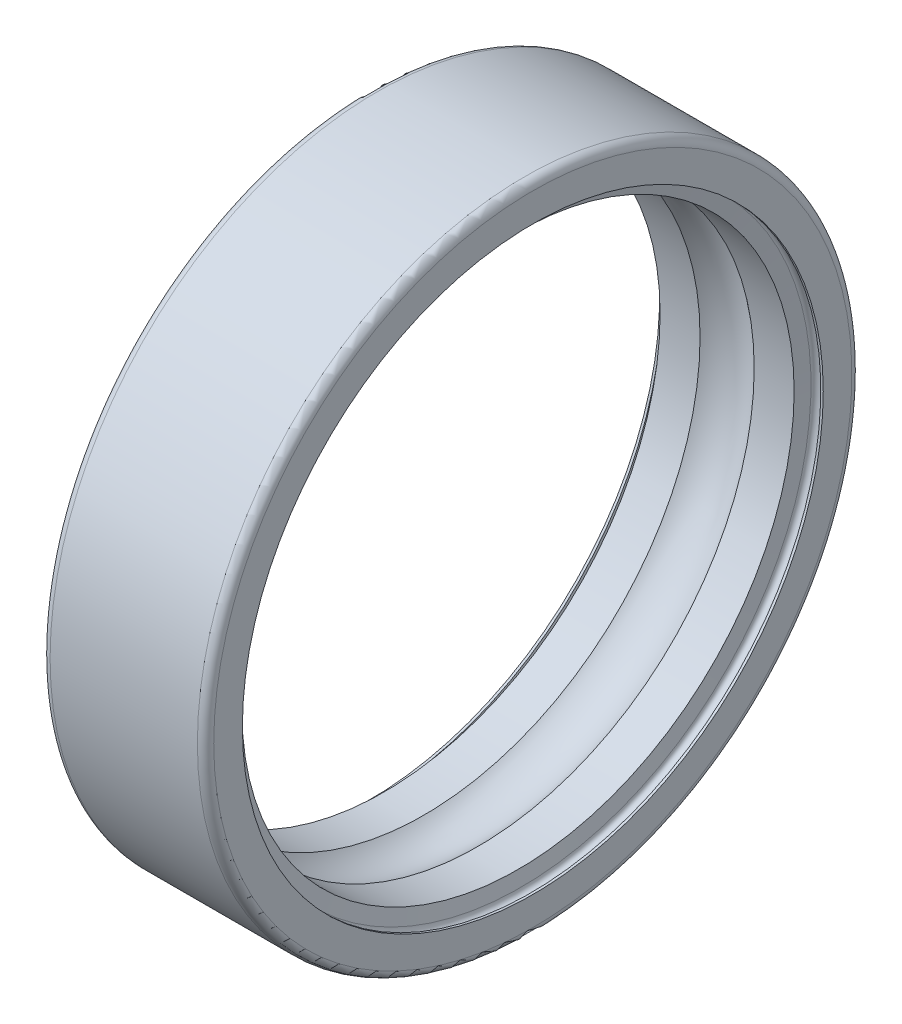
ISO-10303-21;
HEADER;
FILE_DESCRIPTION(('STEP AP214'),'2;1');
FILE_NAME('part.step','',(''),(''),'','','');
FILE_SCHEMA(('AUTOMOTIVE_DESIGN { 1 0 10303 214 1 1 1 1 }'));
ENDSEC;
DATA;
#1=APPLICATION_CONTEXT('core data for automotive mechanical design processes');
#2=APPLICATION_PROTOCOL_DEFINITION('international standard','automotive_design',2000,#1);
#3=PRODUCT_CONTEXT('',#1,'mechanical');
#4=PRODUCT('Part','Part','',(#3));
#5=PRODUCT_RELATED_PRODUCT_CATEGORY('part','',(#4));
#6=PRODUCT_DEFINITION_FORMATION('','',#4);
#7=PRODUCT_DEFINITION_CONTEXT('part definition',#1,'design');
#8=PRODUCT_DEFINITION('design','',#6,#7);
#9=PRODUCT_DEFINITION_SHAPE('','',#8);
#10=(LENGTH_UNIT() NAMED_UNIT(*) SI_UNIT(.MILLI.,.METRE.));
#11=(NAMED_UNIT(*) PLANE_ANGLE_UNIT() SI_UNIT($,.RADIAN.));
#12=(NAMED_UNIT(*) SI_UNIT($,.STERADIAN.) SOLID_ANGLE_UNIT());
#13=UNCERTAINTY_MEASURE_WITH_UNIT(LENGTH_MEASURE(1.E-05),#10,'distance_accuracy_value','');
#14=(GEOMETRIC_REPRESENTATION_CONTEXT(3) GLOBAL_UNCERTAINTY_ASSIGNED_CONTEXT((#13)) GLOBAL_UNIT_ASSIGNED_CONTEXT((#10,
#11,#12)) REPRESENTATION_CONTEXT('',''));
#15=CARTESIAN_POINT('',(0.,0.,0.));
#16=DIRECTION('',(0.,0.,1.));
#17=DIRECTION('',(1.,0.,0.));
#18=AXIS2_PLACEMENT_3D('',#15,#16,#17);
#19=CARTESIAN_POINT('',(0.,-8.0131268697387,-7.8));
#20=DIRECTION('',(-1.,0.,0.));
#21=DIRECTION('',(0.,0.,1.));
#22=AXIS2_PLACEMENT_3D('',#19,#20,#21);
#23=PLANE('',#22);
#24=CARTESIAN_POINT('',(0.,0.,0.));
#25=DIRECTION('',(-1.,0.,0.));
#26=DIRECTION('',(0.,0.,-1.));
#27=AXIS2_PLACEMENT_3D('',#24,#25,#26);
#28=CIRCLE('',#27,7.8);
#29=CARTESIAN_POINT('',(0.,0.,-7.8));
#30=VERTEX_POINT('',#29);
#31=EDGE_CURVE('E62',#30,#30,#28,.F.);
#32=ORIENTED_EDGE('',*,*,#31,.F.);
#33=EDGE_LOOP('',(#32));
#34=FACE_BOUND('',#33,.T.);
#35=CARTESIAN_POINT('',(0.,0.,0.));
#36=DIRECTION('',(1.,0.,0.));
#37=DIRECTION('',(0.,0.,1.));
#38=AXIS2_PLACEMENT_3D('',#35,#36,#37);
#39=CIRCLE('',#38,7.1);
#40=CARTESIAN_POINT('',(0.,0.,7.1));
#41=VERTEX_POINT('',#40);
#42=EDGE_CURVE('E59',#41,#41,#39,.T.);
#43=ORIENTED_EDGE('',*,*,#42,.T.);
#44=EDGE_LOOP('',(#43));
#45=FACE_BOUND('',#44,.T.);
#46=ADVANCED_FACE('F15',(#34,#45),#23,.T.);
#47=CARTESIAN_POINT('',(4.,-8.0131268697387,7.8));
#48=DIRECTION('',(1.,0.,0.));
#49=DIRECTION('',(0.,0.,-1.));
#50=AXIS2_PLACEMENT_3D('',#47,#48,#49);
#51=PLANE('',#50);
#52=CARTESIAN_POINT('',(4.,0.,0.));
#53=DIRECTION('',(1.,0.,0.));
#54=DIRECTION('',(0.,0.,1.));
#55=AXIS2_PLACEMENT_3D('',#52,#53,#54);
#56=CIRCLE('',#55,7.80000011014771);
#57=CARTESIAN_POINT('',(4.,0.,7.80000011014771));
#58=VERTEX_POINT('',#57);
#59=EDGE_CURVE('E56',#58,#58,#56,.T.);
#60=ORIENTED_EDGE('',*,*,#59,.T.);
#61=EDGE_LOOP('',(#60));
#62=FACE_BOUND('',#61,.T.);
#63=CARTESIAN_POINT('',(4.,0.,0.));
#64=DIRECTION('',(-1.,0.,0.));
#65=DIRECTION('',(0.,0.,-1.));
#66=AXIS2_PLACEMENT_3D('',#63,#64,#65);
#67=CIRCLE('',#66,7.1);
#68=CARTESIAN_POINT('',(4.,0.,-7.1));
#69=VERTEX_POINT('',#68);
#70=EDGE_CURVE('E53',#69,#69,#67,.F.);
#71=ORIENTED_EDGE('',*,*,#70,.F.);
#72=EDGE_LOOP('',(#71));
#73=FACE_BOUND('',#72,.T.);
#74=ADVANCED_FACE('F71',(#62,#73),#51,.T.);
#75=CARTESIAN_POINT('',(0.200000000000016,0.,0.));
#76=DIRECTION('',(1.,0.,0.));
#77=DIRECTION('',(0.,0.,1.));
#78=AXIS2_PLACEMENT_3D('',#75,#76,#77);
#79=TOROIDAL_SURFACE('',#78,7.8,0.200000000000014);
#80=ORIENTED_EDGE('',*,*,#31,.T.);
#81=EDGE_LOOP('',(#80));
#82=FACE_BOUND('',#81,.T.);
#83=CARTESIAN_POINT('',(0.200000000000016,0.,0.));
#84=DIRECTION('',(-1.,0.,0.));
#85=DIRECTION('',(0.,0.,-1.));
#86=AXIS2_PLACEMENT_3D('',#83,#84,#85);
#87=CIRCLE('',#86,8.00000000000001);
#88=CARTESIAN_POINT('',(0.200000000000016,0.,-8.00000000000001));
#89=VERTEX_POINT('',#88);
#90=EDGE_CURVE('E50',#89,#89,#87,.F.);
#91=ORIENTED_EDGE('',*,*,#90,.F.);
#92=EDGE_LOOP('',(#91));
#93=FACE_BOUND('',#92,.T.);
#94=ADVANCED_FACE('F66',(#82,#93),#79,.T.);
#95=CARTESIAN_POINT('',(50.,0.,0.));
#96=DIRECTION('',(1.,0.,0.));
#97=DIRECTION('',(0.,0.,1.));
#98=AXIS2_PLACEMENT_3D('',#95,#96,#97);
#99=CYLINDRICAL_SURFACE('',#98,7.1);
#100=CARTESIAN_POINT('',(0.0599999999999952,0.,0.));
#101=DIRECTION('',(1.,0.,0.));
#102=DIRECTION('',(0.,0.,1.));
#103=AXIS2_PLACEMENT_3D('',#100,#101,#102);
#104=CIRCLE('',#103,7.1);
#105=CARTESIAN_POINT('',(0.0599999999999952,0.,7.1));
#106=VERTEX_POINT('',#105);
#107=EDGE_CURVE('E47',#106,#106,#104,.T.);
#108=ORIENTED_EDGE('',*,*,#107,.T.);
#109=EDGE_LOOP('',(#108));
#110=FACE_BOUND('',#109,.T.);
#111=ORIENTED_EDGE('',*,*,#42,.F.);
#112=EDGE_LOOP('',(#111));
#113=FACE_BOUND('',#112,.T.);
#114=ADVANCED_FACE('F75',(#110,#113),#99,.F.);
#115=CARTESIAN_POINT('',(0.18,0.,0.));
#116=DIRECTION('',(1.,0.,0.));
#117=DIRECTION('',(0.,0.,1.));
#118=AXIS2_PLACEMENT_3D('',#115,#116,#117);
#119=TOROIDAL_SURFACE('',#118,7.1,0.12);
#120=ORIENTED_EDGE('',*,*,#107,.F.);
#121=EDGE_LOOP('',(#120));
#122=FACE_BOUND('',#121,.T.);
#123=CARTESIAN_POINT('',(0.3,0.,0.));
#124=DIRECTION('',(1.,0.,0.));
#125=DIRECTION('',(0.,0.,1.));
#126=AXIS2_PLACEMENT_3D('',#123,#124,#125);
#127=CIRCLE('',#126,7.1);
#128=CARTESIAN_POINT('',(0.3,0.,7.1));
#129=VERTEX_POINT('',#128);
#130=EDGE_CURVE('E44',#129,#129,#127,.T.);
#131=ORIENTED_EDGE('',*,*,#130,.T.);
#132=EDGE_LOOP('',(#131));
#133=FACE_BOUND('',#132,.T.);
#134=ADVANCED_FACE('F77',(#122,#133),#119,.F.);
#135=CARTESIAN_POINT('',(0.3,0.,0.));
#136=DIRECTION('',(-1.,0.,0.));
#137=DIRECTION('',(0.,0.,-1.));
#138=AXIS2_PLACEMENT_3D('',#135,#136,#137);
#139=CONICAL_SURFACE('',#138,7.1,1.39626340159548);
#140=ORIENTED_EDGE('',*,*,#130,.F.);
#141=EDGE_LOOP('',(#140));
#142=FACE_BOUND('',#141,.T.);
#143=CARTESIAN_POINT('',(0.361714443247957,0.,0.));
#144=DIRECTION('',(1.,0.,0.));
#145=DIRECTION('',(0.,0.,1.));
#146=AXIS2_PLACEMENT_3D('',#143,#144,#145);
#147=CIRCLE('',#146,6.75);
#148=CARTESIAN_POINT('',(0.361714443247957,0.,6.75));
#149=VERTEX_POINT('',#148);
#150=EDGE_CURVE('E41',#149,#149,#147,.T.);
#151=ORIENTED_EDGE('',*,*,#150,.T.);
#152=EDGE_LOOP('',(#151));
#153=FACE_BOUND('',#152,.T.);
#154=ADVANCED_FACE('F85',(#142,#153),#139,.F.);
#155=CARTESIAN_POINT('',(50.,0.,0.));
#156=DIRECTION('',(1.,0.,0.));
#157=DIRECTION('',(0.,0.,1.));
#158=AXIS2_PLACEMENT_3D('',#155,#156,#157);
#159=CYLINDRICAL_SURFACE('',#158,6.75);
#160=CARTESIAN_POINT('',(1.3385621722339,0.,0.));
#161=DIRECTION('',(1.,0.,0.));
#162=DIRECTION('',(0.,0.,1.));
#163=AXIS2_PLACEMENT_3D('',#160,#161,#162);
#164=CIRCLE('',#163,6.75);
#165=CARTESIAN_POINT('',(1.3385621722339,0.,6.75));
#166=VERTEX_POINT('',#165);
#167=EDGE_CURVE('E38',#166,#166,#164,.T.);
#168=ORIENTED_EDGE('',*,*,#167,.T.);
#169=EDGE_LOOP('',(#168));
#170=FACE_BOUND('',#169,.T.);
#171=ORIENTED_EDGE('',*,*,#150,.F.);
#172=EDGE_LOOP('',(#171));
#173=FACE_BOUND('',#172,.T.);
#174=ADVANCED_FACE('F93',(#170,#173),#159,.F.);
#175=CARTESIAN_POINT('',(2.,0.,0.));
#176=DIRECTION('',(1.,0.,0.));
#177=DIRECTION('',(0.,0.,1.));
#178=AXIS2_PLACEMENT_3D('',#175,#176,#177);
#179=TOROIDAL_SURFACE('',#178,6.00000000000013,0.999999999999873);
#180=ORIENTED_EDGE('',*,*,#167,.F.);
#181=EDGE_LOOP('',(#180));
#182=FACE_BOUND('',#181,.T.);
#183=CARTESIAN_POINT('',(2.6614378277661,0.,0.));
#184=DIRECTION('',(1.,0.,0.));
#185=DIRECTION('',(0.,0.,1.));
#186=AXIS2_PLACEMENT_3D('',#183,#184,#185);
#187=CIRCLE('',#186,6.75);
#188=CARTESIAN_POINT('',(2.6614378277661,0.,6.75));
#189=VERTEX_POINT('',#188);
#190=EDGE_CURVE('E35',#189,#189,#187,.T.);
#191=ORIENTED_EDGE('',*,*,#190,.T.);
#192=EDGE_LOOP('',(#191));
#193=FACE_BOUND('',#192,.T.);
#194=ADVANCED_FACE('F97',(#182,#193),#179,.F.);
#195=CARTESIAN_POINT('',(50.,0.,0.));
#196=DIRECTION('',(1.,0.,0.));
#197=DIRECTION('',(0.,0.,1.));
#198=AXIS2_PLACEMENT_3D('',#195,#196,#197);
#199=CYLINDRICAL_SURFACE('',#198,6.75);
#200=CARTESIAN_POINT('',(3.638285556752,0.,0.));
#201=DIRECTION('',(1.,0.,0.));
#202=DIRECTION('',(0.,0.,1.));
#203=AXIS2_PLACEMENT_3D('',#200,#201,#202);
#204=CIRCLE('',#203,6.75);
#205=CARTESIAN_POINT('',(3.638285556752,0.,6.75));
#206=VERTEX_POINT('',#205);
#207=EDGE_CURVE('E30',#206,#206,#204,.T.);
#208=ORIENTED_EDGE('',*,*,#207,.T.);
#209=EDGE_LOOP('',(#208));
#210=FACE_BOUND('',#209,.T.);
#211=ORIENTED_EDGE('',*,*,#190,.F.);
#212=EDGE_LOOP('',(#211));
#213=FACE_BOUND('',#212,.T.);
#214=ADVANCED_FACE('F101',(#210,#213),#199,.F.);
#215=CARTESIAN_POINT('',(3.7,0.,0.));
#216=DIRECTION('',(1.,0.,0.));
#217=DIRECTION('',(0.,0.,1.));
#218=AXIS2_PLACEMENT_3D('',#215,#216,#217);
#219=CONICAL_SURFACE('',#218,7.1,1.39626340159535);
#220=CARTESIAN_POINT('',(3.7,0.,0.));
#221=DIRECTION('',(1.,0.,0.));
#222=DIRECTION('',(0.,0.,1.));
#223=AXIS2_PLACEMENT_3D('',#220,#221,#222);
#224=CIRCLE('',#223,7.1);
#225=CARTESIAN_POINT('',(3.7,0.,7.1));
#226=VERTEX_POINT('',#225);
#227=EDGE_CURVE('E26',#226,#226,#224,.T.);
#228=ORIENTED_EDGE('',*,*,#227,.T.);
#229=EDGE_LOOP('',(#228));
#230=FACE_BOUND('',#229,.T.);
#231=ORIENTED_EDGE('',*,*,#207,.F.);
#232=EDGE_LOOP('',(#231));
#233=FACE_BOUND('',#232,.T.);
#234=ADVANCED_FACE('F105',(#230,#233),#219,.F.);
#235=CARTESIAN_POINT('',(3.82,0.,0.));
#236=DIRECTION('',(1.,0.,0.));
#237=DIRECTION('',(0.,0.,1.));
#238=AXIS2_PLACEMENT_3D('',#235,#236,#237);
#239=TOROIDAL_SURFACE('',#238,7.1,0.12);
#240=ORIENTED_EDGE('',*,*,#227,.F.);
#241=EDGE_LOOP('',(#240));
#242=FACE_BOUND('',#241,.T.);
#243=CARTESIAN_POINT('',(3.94,0.,0.));
#244=DIRECTION('',(1.,0.,0.));
#245=DIRECTION('',(0.,0.,1.));
#246=AXIS2_PLACEMENT_3D('',#243,#244,#245);
#247=CIRCLE('',#246,7.1);
#248=CARTESIAN_POINT('',(3.94,0.,7.1));
#249=VERTEX_POINT('',#248);
#250=EDGE_CURVE('E22',#249,#249,#247,.T.);
#251=ORIENTED_EDGE('',*,*,#250,.T.);
#252=EDGE_LOOP('',(#251));
#253=FACE_BOUND('',#252,.T.);
#254=ADVANCED_FACE('F109',(#242,#253),#239,.F.);
#255=CARTESIAN_POINT('',(50.,0.,0.));
#256=DIRECTION('',(1.,0.,0.));
#257=DIRECTION('',(0.,0.,1.));
#258=AXIS2_PLACEMENT_3D('',#255,#256,#257);
#259=CYLINDRICAL_SURFACE('',#258,7.1);
#260=ORIENTED_EDGE('',*,*,#70,.T.);
#261=EDGE_LOOP('',(#260));
#262=FACE_BOUND('',#261,.T.);
#263=ORIENTED_EDGE('',*,*,#250,.F.);
#264=EDGE_LOOP('',(#263));
#265=FACE_BOUND('',#264,.T.);
#266=ADVANCED_FACE('F113',(#262,#265),#259,.F.);
#267=CARTESIAN_POINT('',(3.8,0.,0.));
#268=DIRECTION('',(1.,0.,0.));
#269=DIRECTION('',(0.,0.,1.));
#270=AXIS2_PLACEMENT_3D('',#267,#268,#269);
#271=TOROIDAL_SURFACE('',#270,7.8,0.200000000000031);
#272=CARTESIAN_POINT('',(3.8,0.,0.));
#273=DIRECTION('',(1.,0.,0.));
#274=DIRECTION('',(0.,0.,1.));
#275=AXIS2_PLACEMENT_3D('',#272,#273,#274);
#276=CIRCLE('',#275,8.00000000000003);
#277=CARTESIAN_POINT('',(3.8,0.,8.00000000000003));
#278=VERTEX_POINT('',#277);
#279=EDGE_CURVE('E10',#278,#278,#276,.T.);
#280=ORIENTED_EDGE('',*,*,#279,.T.);
#281=EDGE_LOOP('',(#280));
#282=FACE_BOUND('',#281,.T.);
#283=ORIENTED_EDGE('',*,*,#59,.F.);
#284=EDGE_LOOP('',(#283));
#285=FACE_BOUND('',#284,.T.);
#286=ADVANCED_FACE('F116',(#282,#285),#271,.T.);
#287=CARTESIAN_POINT('',(50.,0.,0.));
#288=DIRECTION('',(1.,0.,0.));
#289=DIRECTION('',(0.,0.,1.));
#290=AXIS2_PLACEMENT_3D('',#287,#288,#289);
#291=CYLINDRICAL_SURFACE('',#290,8.);
#292=ORIENTED_EDGE('',*,*,#90,.T.);
#293=EDGE_LOOP('',(#292));
#294=FACE_BOUND('',#293,.T.);
#295=ORIENTED_EDGE('',*,*,#279,.F.);
#296=EDGE_LOOP('',(#295));
#297=FACE_BOUND('',#296,.T.);
#298=ADVANCED_FACE('F17',(#294,#297),#291,.T.);
#299=CLOSED_SHELL('',(#46,#74,#94,#114,#134,#154,#174,#194,#214,#234,#254,#266,#286,#298));
#300=MANIFOLD_SOLID_BREP('B1',#299);
#301=ADVANCED_BREP_SHAPE_REPRESENTATION('',(#18,#300),#14);
#302=SHAPE_DEFINITION_REPRESENTATION(#9,#301);
ENDSEC;
END-ISO-10303-21;
